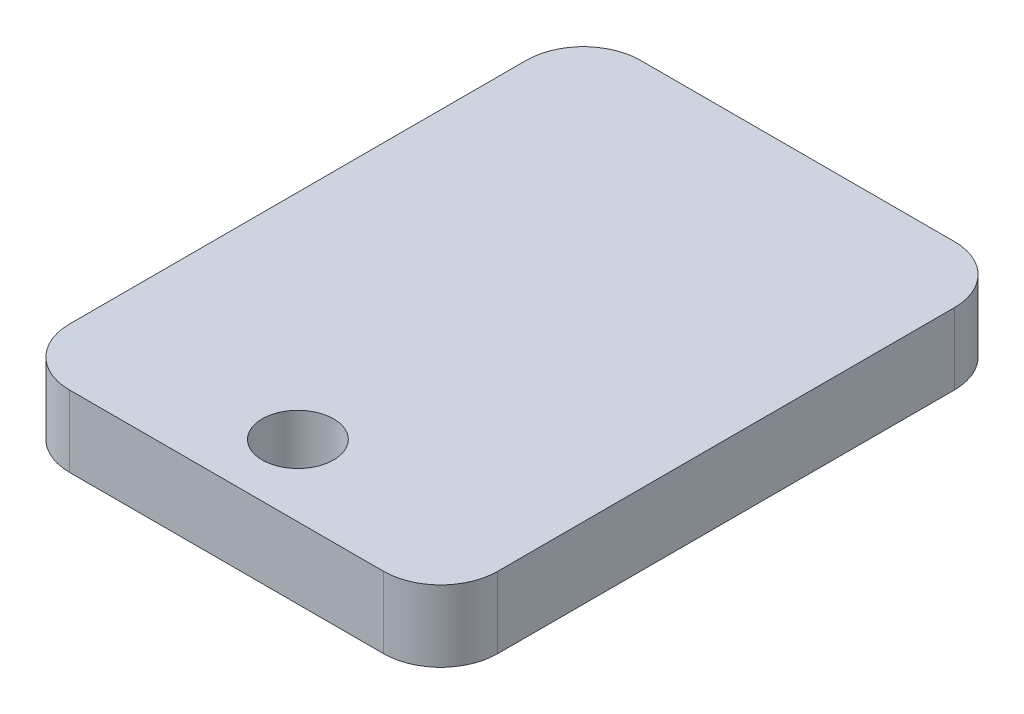
ISO-10303-21;
HEADER;
FILE_DESCRIPTION(('STEP AP214'),'2;1');
FILE_NAME('part.step','',(''),(''),'','','');
FILE_SCHEMA(('AUTOMOTIVE_DESIGN { 1 0 10303 214 1 1 1 1 }'));
ENDSEC;
DATA;
#1=APPLICATION_CONTEXT('core data for automotive mechanical design processes');
#2=APPLICATION_PROTOCOL_DEFINITION('international standard','automotive_design',2000,#1);
#3=PRODUCT_CONTEXT('',#1,'mechanical');
#4=PRODUCT('Part','Part','',(#3));
#5=PRODUCT_RELATED_PRODUCT_CATEGORY('part','',(#4));
#6=PRODUCT_DEFINITION_FORMATION('','',#4);
#7=PRODUCT_DEFINITION_CONTEXT('part definition',#1,'design');
#8=PRODUCT_DEFINITION('design','',#6,#7);
#9=PRODUCT_DEFINITION_SHAPE('','',#8);
#10=(LENGTH_UNIT() NAMED_UNIT(*) SI_UNIT(.MILLI.,.METRE.));
#11=(NAMED_UNIT(*) PLANE_ANGLE_UNIT() SI_UNIT($,.RADIAN.));
#12=(NAMED_UNIT(*) SI_UNIT($,.STERADIAN.) SOLID_ANGLE_UNIT());
#13=UNCERTAINTY_MEASURE_WITH_UNIT(LENGTH_MEASURE(1.E-05),#10,'distance_accuracy_value','');
#14=(GEOMETRIC_REPRESENTATION_CONTEXT(3) GLOBAL_UNCERTAINTY_ASSIGNED_CONTEXT((#13)) GLOBAL_UNIT_ASSIGNED_CONTEXT((#10,
#11,#12)) REPRESENTATION_CONTEXT('',''));
#15=CARTESIAN_POINT('',(0.,0.,0.));
#16=DIRECTION('',(0.,0.,1.));
#17=DIRECTION('',(1.,0.,0.));
#18=AXIS2_PLACEMENT_3D('',#15,#16,#17);
#19=CARTESIAN_POINT('',(13.97,3.175,20.32));
#20=DIRECTION('',(0.,1.,0.));
#21=DIRECTION('',(0.,0.,1.));
#22=AXIS2_PLACEMENT_3D('',#19,#20,#21);
#23=PLANE('',#22);
#24=CARTESIAN_POINT('',(13.97,3.175,20.32));
#25=DIRECTION('',(0.,1.,0.));
#26=DIRECTION('',(0.,0.,1.));
#27=AXIS2_PLACEMENT_3D('',#24,#25,#26);
#28=CIRCLE('',#27,5.08);
#29=CARTESIAN_POINT('',(13.97,3.175,25.4));
#30=VERTEX_POINT('',#29);
#31=CARTESIAN_POINT('',(19.05,3.175,20.32));
#32=VERTEX_POINT('',#31);
#33=EDGE_CURVE('E164',#30,#32,#28,.T.);
#34=ORIENTED_EDGE('',*,*,#33,.T.);
#35=DIRECTION('',(0.,0.,-1.));
#36=VECTOR('',#35,1.);
#37=CARTESIAN_POINT('',(19.05,3.175,20.32));
#38=LINE('',#37,#36);
#39=CARTESIAN_POINT('',(19.05,3.175,-20.32));
#40=VERTEX_POINT('',#39);
#41=EDGE_CURVE('E100',#32,#40,#38,.T.);
#42=ORIENTED_EDGE('',*,*,#41,.T.);
#43=CARTESIAN_POINT('',(13.97,3.175,-20.32));
#44=DIRECTION('',(0.,1.,0.));
#45=DIRECTION('',(0.,0.,-1.));
#46=AXIS2_PLACEMENT_3D('',#43,#44,#45);
#47=CIRCLE('',#46,5.08);
#48=CARTESIAN_POINT('',(13.97,3.175,-25.4));
#49=VERTEX_POINT('',#48);
#50=EDGE_CURVE('E185',#40,#49,#47,.T.);
#51=ORIENTED_EDGE('',*,*,#50,.T.);
#52=DIRECTION('',(-1.,0.,0.));
#53=VECTOR('',#52,1.);
#54=CARTESIAN_POINT('',(-13.97,3.175,-25.4));
#55=LINE('',#54,#53);
#56=CARTESIAN_POINT('',(-13.97,3.175,-25.4));
#57=VERTEX_POINT('',#56);
#58=EDGE_CURVE('E199',#49,#57,#55,.T.);
#59=ORIENTED_EDGE('',*,*,#58,.T.);
#60=CARTESIAN_POINT('',(-13.97,3.175,-20.32));
#61=DIRECTION('',(0.,1.,0.));
#62=DIRECTION('',(0.,0.,-1.));
#63=AXIS2_PLACEMENT_3D('',#60,#61,#62);
#64=CIRCLE('',#63,5.08);
#65=CARTESIAN_POINT('',(-19.05,3.175,-20.32));
#66=VERTEX_POINT('',#65);
#67=EDGE_CURVE('E119',#57,#66,#64,.T.);
#68=ORIENTED_EDGE('',*,*,#67,.T.);
#69=DIRECTION('',(0.,0.,1.));
#70=VECTOR('',#69,1.);
#71=CARTESIAN_POINT('',(-19.05,3.175,20.32));
#72=LINE('',#71,#70);
#73=CARTESIAN_POINT('',(-19.05,3.175,20.32));
#74=VERTEX_POINT('',#73);
#75=EDGE_CURVE('E113',#66,#74,#72,.T.);
#76=ORIENTED_EDGE('',*,*,#75,.T.);
#77=CARTESIAN_POINT('',(-13.97,3.175,20.32));
#78=DIRECTION('',(0.,1.,0.));
#79=DIRECTION('',(0.,0.,-1.));
#80=AXIS2_PLACEMENT_3D('',#77,#78,#79);
#81=CIRCLE('',#80,5.08);
#82=CARTESIAN_POINT('',(-13.97,3.175,25.4));
#83=VERTEX_POINT('',#82);
#84=EDGE_CURVE('E117',#74,#83,#81,.T.);
#85=ORIENTED_EDGE('',*,*,#84,.T.);
#86=DIRECTION('',(1.,0.,0.));
#87=VECTOR('',#86,1.);
#88=CARTESIAN_POINT('',(-13.97,3.175,25.4));
#89=LINE('',#88,#87);
#90=EDGE_CURVE('E57',#83,#30,#89,.T.);
#91=ORIENTED_EDGE('',*,*,#90,.T.);
#92=EDGE_LOOP('',(#34,#42,#51,#59,#68,#76,#85,#91));
#93=FACE_BOUND('',#92,.T.);
#94=CARTESIAN_POINT('',(0.,3.175,19.05));
#95=DIRECTION('',(0.,1.,0.));
#96=DIRECTION('',(0.,0.,1.));
#97=AXIS2_PLACEMENT_3D('',#94,#95,#96);
#98=CIRCLE('',#97,3.175);
#99=CARTESIAN_POINT('',(0.,3.175,22.225));
#100=VERTEX_POINT('',#99);
#101=EDGE_CURVE('E146',#100,#100,#98,.T.);
#102=ORIENTED_EDGE('',*,*,#101,.F.);
#103=EDGE_LOOP('',(#102));
#104=FACE_BOUND('',#103,.T.);
#105=ADVANCED_FACE('F39',(#93,#104),#23,.T.);
#106=CARTESIAN_POINT('',(13.97,-3.175,20.32));
#107=DIRECTION('',(0.,1.,0.));
#108=DIRECTION('',(0.,0.,1.));
#109=AXIS2_PLACEMENT_3D('',#106,#107,#108);
#110=PLANE('',#109);
#111=CARTESIAN_POINT('',(13.97,-3.175,20.32));
#112=DIRECTION('',(0.,1.,0.));
#113=DIRECTION('',(0.,0.,1.));
#114=AXIS2_PLACEMENT_3D('',#111,#112,#113);
#115=CIRCLE('',#114,5.08);
#116=CARTESIAN_POINT('',(13.97,-3.175,25.4));
#117=VERTEX_POINT('',#116);
#118=CARTESIAN_POINT('',(19.05,-3.175,20.32));
#119=VERTEX_POINT('',#118);
#120=EDGE_CURVE('E141',#117,#119,#115,.T.);
#121=ORIENTED_EDGE('',*,*,#120,.F.);
#122=DIRECTION('',(1.,0.,0.));
#123=VECTOR('',#122,1.);
#124=CARTESIAN_POINT('',(-13.97,-3.175,25.4));
#125=LINE('',#124,#123);
#126=CARTESIAN_POINT('',(-13.97,-3.175,25.4));
#127=VERTEX_POINT('',#126);
#128=EDGE_CURVE('E92',#127,#117,#125,.T.);
#129=ORIENTED_EDGE('',*,*,#128,.F.);
#130=CARTESIAN_POINT('',(-13.97,-3.175,20.32));
#131=DIRECTION('',(0.,1.,0.));
#132=DIRECTION('',(0.,0.,-1.));
#133=AXIS2_PLACEMENT_3D('',#130,#131,#132);
#134=CIRCLE('',#133,5.08);
#135=CARTESIAN_POINT('',(-19.05,-3.175,20.32));
#136=VERTEX_POINT('',#135);
#137=EDGE_CURVE('E86',#136,#127,#134,.T.);
#138=ORIENTED_EDGE('',*,*,#137,.F.);
#139=DIRECTION('',(0.,0.,1.));
#140=VECTOR('',#139,1.);
#141=CARTESIAN_POINT('',(-19.05,-3.175,20.32));
#142=LINE('',#141,#140);
#143=CARTESIAN_POINT('',(-19.05,-3.175,-20.32));
#144=VERTEX_POINT('',#143);
#145=EDGE_CURVE('E128',#144,#136,#142,.T.);
#146=ORIENTED_EDGE('',*,*,#145,.F.);
#147=CARTESIAN_POINT('',(-13.97,-3.175,-20.32));
#148=DIRECTION('',(0.,1.,0.));
#149=DIRECTION('',(0.,0.,-1.));
#150=AXIS2_PLACEMENT_3D('',#147,#148,#149);
#151=CIRCLE('',#150,5.08);
#152=CARTESIAN_POINT('',(-13.97,-3.175,-25.4));
#153=VERTEX_POINT('',#152);
#154=EDGE_CURVE('E155',#153,#144,#151,.T.);
#155=ORIENTED_EDGE('',*,*,#154,.F.);
#156=DIRECTION('',(-1.,0.,0.));
#157=VECTOR('',#156,1.);
#158=CARTESIAN_POINT('',(-13.97,-3.175,-25.4));
#159=LINE('',#158,#157);
#160=CARTESIAN_POINT('',(13.97,-3.175,-25.4));
#161=VERTEX_POINT('',#160);
#162=EDGE_CURVE('E152',#161,#153,#159,.T.);
#163=ORIENTED_EDGE('',*,*,#162,.F.);
#164=CARTESIAN_POINT('',(13.97,-3.175,-20.32));
#165=DIRECTION('',(0.,1.,0.));
#166=DIRECTION('',(0.,0.,-1.));
#167=AXIS2_PLACEMENT_3D('',#164,#165,#166);
#168=CIRCLE('',#167,5.08);
#169=CARTESIAN_POINT('',(19.05,-3.175,-20.32));
#170=VERTEX_POINT('',#169);
#171=EDGE_CURVE('E149',#170,#161,#168,.T.);
#172=ORIENTED_EDGE('',*,*,#171,.F.);
#173=DIRECTION('',(0.,0.,-1.));
#174=VECTOR('',#173,1.);
#175=CARTESIAN_POINT('',(19.05,-3.175,20.32));
#176=LINE('',#175,#174);
#177=EDGE_CURVE('E145',#119,#170,#176,.T.);
#178=ORIENTED_EDGE('',*,*,#177,.F.);
#179=EDGE_LOOP('',(#121,#129,#138,#146,#155,#163,#172,#178));
#180=FACE_BOUND('',#179,.T.);
#181=CARTESIAN_POINT('',(0.,-3.175,19.05));
#182=DIRECTION('',(0.,1.,0.));
#183=DIRECTION('',(0.,0.,1.));
#184=AXIS2_PLACEMENT_3D('',#181,#182,#183);
#185=CIRCLE('',#184,3.175);
#186=CARTESIAN_POINT('',(0.,-3.175,22.225));
#187=VERTEX_POINT('',#186);
#188=EDGE_CURVE('E209',#187,#187,#185,.T.);
#189=ORIENTED_EDGE('',*,*,#188,.T.);
#190=EDGE_LOOP('',(#189));
#191=FACE_BOUND('',#190,.T.);
#192=ADVANCED_FACE('F189',(#180,#191),#110,.F.);
#193=CARTESIAN_POINT('',(13.97,3.175,20.32));
#194=DIRECTION('',(0.,-1.,0.));
#195=DIRECTION('',(0.,0.,-1.));
#196=AXIS2_PLACEMENT_3D('',#193,#194,#195);
#197=CYLINDRICAL_SURFACE('',#196,5.08);
#198=ORIENTED_EDGE('',*,*,#120,.T.);
#199=DIRECTION('',(0.,-1.,0.));
#200=VECTOR('',#199,1.);
#201=CARTESIAN_POINT('',(19.05,3.175,20.32));
#202=LINE('',#201,#200);
#203=EDGE_CURVE('E11',#32,#119,#202,.T.);
#204=ORIENTED_EDGE('',*,*,#203,.F.);
#205=ORIENTED_EDGE('',*,*,#33,.F.);
#206=DIRECTION('',(0.,-1.,0.));
#207=VECTOR('',#206,1.);
#208=CARTESIAN_POINT('',(13.97,3.175,25.4));
#209=LINE('',#208,#207);
#210=EDGE_CURVE('E137',#30,#117,#209,.T.);
#211=ORIENTED_EDGE('',*,*,#210,.T.);
#212=EDGE_LOOP('',(#198,#204,#205,#211));
#213=FACE_BOUND('',#212,.T.);
#214=ADVANCED_FACE('F41',(#213),#197,.T.);
#215=CARTESIAN_POINT('',(19.05,3.175,20.32));
#216=DIRECTION('',(-1.,0.,0.));
#217=DIRECTION('',(0.,0.,1.));
#218=AXIS2_PLACEMENT_3D('',#215,#216,#217);
#219=PLANE('',#218);
#220=ORIENTED_EDGE('',*,*,#177,.T.);
#221=DIRECTION('',(0.,-1.,0.));
#222=VECTOR('',#221,1.);
#223=CARTESIAN_POINT('',(19.05,3.175,-20.32));
#224=LINE('',#223,#222);
#225=EDGE_CURVE('E49',#40,#170,#224,.T.);
#226=ORIENTED_EDGE('',*,*,#225,.F.);
#227=ORIENTED_EDGE('',*,*,#41,.F.);
#228=ORIENTED_EDGE('',*,*,#203,.T.);
#229=EDGE_LOOP('',(#220,#226,#227,#228));
#230=FACE_BOUND('',#229,.T.);
#231=ADVANCED_FACE('F239',(#230),#219,.F.);
#232=CARTESIAN_POINT('',(13.97,3.175,-20.32));
#233=DIRECTION('',(0.,-1.,0.));
#234=DIRECTION('',(0.,0.,-1.));
#235=AXIS2_PLACEMENT_3D('',#232,#233,#234);
#236=CYLINDRICAL_SURFACE('',#235,5.08);
#237=ORIENTED_EDGE('',*,*,#171,.T.);
#238=DIRECTION('',(0.,-1.,0.));
#239=VECTOR('',#238,1.);
#240=CARTESIAN_POINT('',(13.97,3.175,-25.4));
#241=LINE('',#240,#239);
#242=EDGE_CURVE('E175',#49,#161,#241,.T.);
#243=ORIENTED_EDGE('',*,*,#242,.F.);
#244=ORIENTED_EDGE('',*,*,#50,.F.);
#245=ORIENTED_EDGE('',*,*,#225,.T.);
#246=EDGE_LOOP('',(#237,#243,#244,#245));
#247=FACE_BOUND('',#246,.T.);
#248=ADVANCED_FACE('F183',(#247),#236,.T.);
#249=CARTESIAN_POINT('',(-13.97,3.175,-25.4));
#250=DIRECTION('',(0.,0.,1.));
#251=DIRECTION('',(1.,0.,0.));
#252=AXIS2_PLACEMENT_3D('',#249,#250,#251);
#253=PLANE('',#252);
#254=ORIENTED_EDGE('',*,*,#162,.T.);
#255=DIRECTION('',(0.,-1.,0.));
#256=VECTOR('',#255,1.);
#257=CARTESIAN_POINT('',(-13.97,3.175,-25.4));
#258=LINE('',#257,#256);
#259=EDGE_CURVE('E171',#57,#153,#258,.T.);
#260=ORIENTED_EDGE('',*,*,#259,.F.);
#261=ORIENTED_EDGE('',*,*,#58,.F.);
#262=ORIENTED_EDGE('',*,*,#242,.T.);
#263=EDGE_LOOP('',(#254,#260,#261,#262));
#264=FACE_BOUND('',#263,.T.);
#265=ADVANCED_FACE('F194',(#264),#253,.F.);
#266=CARTESIAN_POINT('',(-13.97,3.175,-20.32));
#267=DIRECTION('',(0.,-1.,0.));
#268=DIRECTION('',(0.,0.,-1.));
#269=AXIS2_PLACEMENT_3D('',#266,#267,#268);
#270=CYLINDRICAL_SURFACE('',#269,5.08);
#271=ORIENTED_EDGE('',*,*,#154,.T.);
#272=DIRECTION('',(0.,-1.,0.));
#273=VECTOR('',#272,1.);
#274=CARTESIAN_POINT('',(-19.05,3.175,-20.32));
#275=LINE('',#274,#273);
#276=EDGE_CURVE('E130',#66,#144,#275,.T.);
#277=ORIENTED_EDGE('',*,*,#276,.F.);
#278=ORIENTED_EDGE('',*,*,#67,.F.);
#279=ORIENTED_EDGE('',*,*,#259,.T.);
#280=EDGE_LOOP('',(#271,#277,#278,#279));
#281=FACE_BOUND('',#280,.T.);
#282=ADVANCED_FACE('F197',(#281),#270,.T.);
#283=CARTESIAN_POINT('',(-19.05,3.175,20.32));
#284=DIRECTION('',(1.,0.,0.));
#285=DIRECTION('',(0.,0.,-1.));
#286=AXIS2_PLACEMENT_3D('',#283,#284,#285);
#287=PLANE('',#286);
#288=ORIENTED_EDGE('',*,*,#145,.T.);
#289=DIRECTION('',(0.,-1.,0.));
#290=VECTOR('',#289,1.);
#291=CARTESIAN_POINT('',(-19.05,3.175,20.32));
#292=LINE('',#291,#290);
#293=EDGE_CURVE('E125',#74,#136,#292,.T.);
#294=ORIENTED_EDGE('',*,*,#293,.F.);
#295=ORIENTED_EDGE('',*,*,#75,.F.);
#296=ORIENTED_EDGE('',*,*,#276,.T.);
#297=EDGE_LOOP('',(#288,#294,#295,#296));
#298=FACE_BOUND('',#297,.T.);
#299=ADVANCED_FACE('F126',(#298),#287,.F.);
#300=CARTESIAN_POINT('',(-13.97,3.175,20.32));
#301=DIRECTION('',(0.,-1.,0.));
#302=DIRECTION('',(0.,0.,-1.));
#303=AXIS2_PLACEMENT_3D('',#300,#301,#302);
#304=CYLINDRICAL_SURFACE('',#303,5.08);
#305=ORIENTED_EDGE('',*,*,#137,.T.);
#306=DIRECTION('',(0.,-1.,0.));
#307=VECTOR('',#306,1.);
#308=CARTESIAN_POINT('',(-13.97,3.175,25.4));
#309=LINE('',#308,#307);
#310=EDGE_CURVE('E131',#83,#127,#309,.T.);
#311=ORIENTED_EDGE('',*,*,#310,.F.);
#312=ORIENTED_EDGE('',*,*,#84,.F.);
#313=ORIENTED_EDGE('',*,*,#293,.T.);
#314=EDGE_LOOP('',(#305,#311,#312,#313));
#315=FACE_BOUND('',#314,.T.);
#316=ADVANCED_FACE('F133',(#315),#304,.T.);
#317=CARTESIAN_POINT('',(-13.97,3.175,25.4));
#318=DIRECTION('',(0.,0.,-1.));
#319=DIRECTION('',(-1.,0.,0.));
#320=AXIS2_PLACEMENT_3D('',#317,#318,#319);
#321=PLANE('',#320);
#322=ORIENTED_EDGE('',*,*,#128,.T.);
#323=ORIENTED_EDGE('',*,*,#210,.F.);
#324=ORIENTED_EDGE('',*,*,#90,.F.);
#325=ORIENTED_EDGE('',*,*,#310,.T.);
#326=EDGE_LOOP('',(#322,#323,#324,#325));
#327=FACE_BOUND('',#326,.T.);
#328=ADVANCED_FACE('F227',(#327),#321,.F.);
#329=CARTESIAN_POINT('',(0.,3.175,19.05));
#330=DIRECTION('',(0.,-1.,0.));
#331=DIRECTION('',(0.,0.,-1.));
#332=AXIS2_PLACEMENT_3D('',#329,#330,#331);
#333=CYLINDRICAL_SURFACE('',#332,3.175);
#334=ORIENTED_EDGE('',*,*,#101,.T.);
#335=EDGE_LOOP('',(#334));
#336=FACE_BOUND('',#335,.T.);
#337=ORIENTED_EDGE('',*,*,#188,.F.);
#338=EDGE_LOOP('',(#337));
#339=FACE_BOUND('',#338,.T.);
#340=ADVANCED_FACE('F217',(#336,#339),#333,.F.);
#341=CLOSED_SHELL('',(#105,#192,#214,#231,#248,#265,#282,#299,#316,#328,#340));
#342=MANIFOLD_SOLID_BREP('B2',#341);
#343=ADVANCED_BREP_SHAPE_REPRESENTATION('',(#18,#342),#14);
#344=SHAPE_DEFINITION_REPRESENTATION(#9,#343);
ENDSEC;
END-ISO-10303-21;
